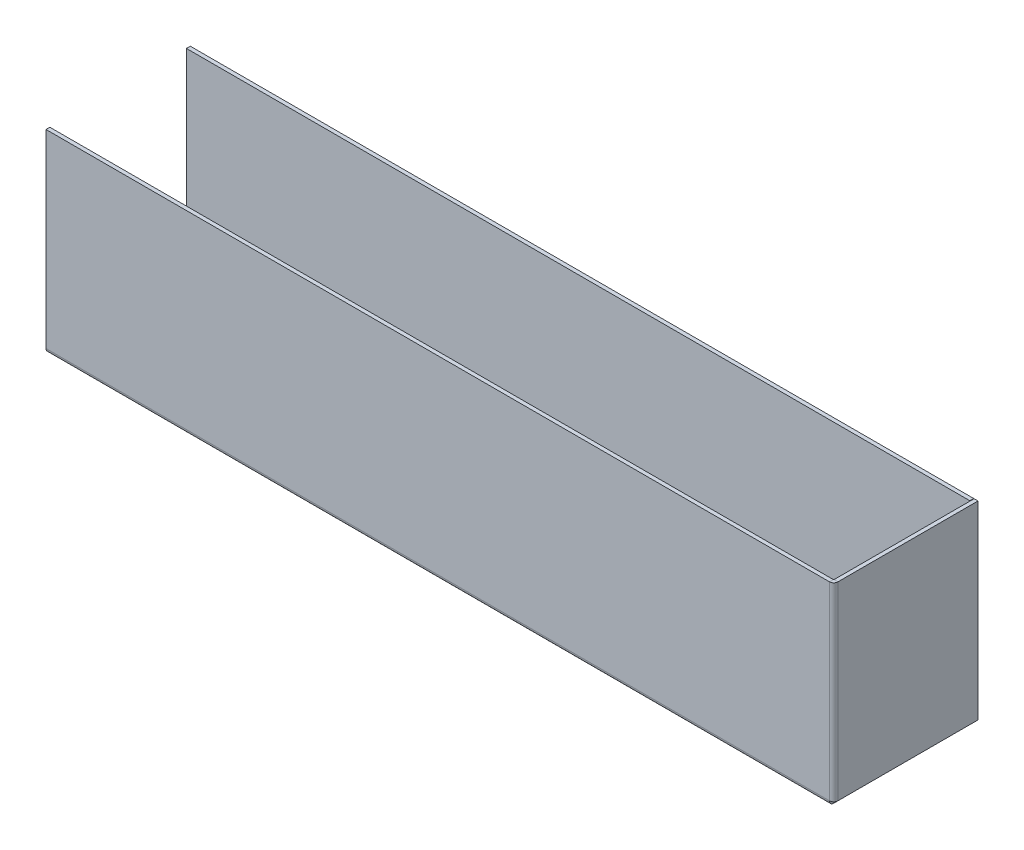
ISO-10303-21;
HEADER;
FILE_DESCRIPTION(('STEP AP214'),'2;1');
FILE_NAME('part.step','',(''),(''),'','','');
FILE_SCHEMA(('AUTOMOTIVE_DESIGN { 1 0 10303 214 1 1 1 1 }'));
ENDSEC;
DATA;
#1=APPLICATION_CONTEXT('core data for automotive mechanical design processes');
#2=APPLICATION_PROTOCOL_DEFINITION('international standard','automotive_design',2000,#1);
#3=PRODUCT_CONTEXT('',#1,'mechanical');
#4=PRODUCT('Part','Part','',(#3));
#5=PRODUCT_RELATED_PRODUCT_CATEGORY('part','',(#4));
#6=PRODUCT_DEFINITION_FORMATION('','',#4);
#7=PRODUCT_DEFINITION_CONTEXT('part definition',#1,'design');
#8=PRODUCT_DEFINITION('design','',#6,#7);
#9=PRODUCT_DEFINITION_SHAPE('','',#8);
#10=(LENGTH_UNIT() NAMED_UNIT(*) SI_UNIT(.MILLI.,.METRE.));
#11=(NAMED_UNIT(*) PLANE_ANGLE_UNIT() SI_UNIT($,.RADIAN.));
#12=(NAMED_UNIT(*) SI_UNIT($,.STERADIAN.) SOLID_ANGLE_UNIT());
#13=UNCERTAINTY_MEASURE_WITH_UNIT(LENGTH_MEASURE(1.E-05),#10,'distance_accuracy_value','');
#14=(GEOMETRIC_REPRESENTATION_CONTEXT(3) GLOBAL_UNCERTAINTY_ASSIGNED_CONTEXT((#13)) GLOBAL_UNIT_ASSIGNED_CONTEXT((#10,
#11,#12)) REPRESENTATION_CONTEXT('',''));
#15=CARTESIAN_POINT('',(0.,0.,0.));
#16=DIRECTION('',(0.,0.,1.));
#17=DIRECTION('',(1.,0.,0.));
#18=AXIS2_PLACEMENT_3D('',#15,#16,#17);
#19=CARTESIAN_POINT('',(0.,-1.,0.));
#20=DIRECTION('',(-1.,0.,0.));
#21=DIRECTION('',(0.,0.,1.));
#22=AXIS2_PLACEMENT_3D('',#19,#20,#21);
#23=PLANE('',#22);
#24=DIRECTION('',(0.,0.,1.));
#25=VECTOR('',#24,1.);
#26=CARTESIAN_POINT('',(0.,-1.,0.));
#27=LINE('',#26,#25);
#28=CARTESIAN_POINT('',(0.,-1.00000000000001,-13.5));
#29=VERTEX_POINT('',#28);
#30=CARTESIAN_POINT('',(0.,-1.,-0.26614580154031));
#31=VERTEX_POINT('',#30);
#32=EDGE_CURVE('E136',#29,#31,#27,.T.);
#33=ORIENTED_EDGE('',*,*,#32,.T.);
#34=DIRECTION('',(0.,1.,0.));
#35=VECTOR('',#34,1.);
#36=CARTESIAN_POINT('',(0.,-1.,-0.26614580154031));
#37=LINE('',#36,#35);
#38=CARTESIAN_POINT('',(0.,0.,-0.26614580154031));
#39=VERTEX_POINT('',#38);
#40=EDGE_CURVE('E469',#31,#39,#37,.T.);
#41=ORIENTED_EDGE('',*,*,#40,.T.);
#42=DIRECTION('',(0.,0.,1.));
#43=VECTOR('',#42,1.);
#44=CARTESIAN_POINT('',(0.,0.,0.));
#45=LINE('',#44,#43);
#46=CARTESIAN_POINT('',(0.,0.,-13.5));
#47=VERTEX_POINT('',#46);
#48=EDGE_CURVE('E179',#47,#39,#45,.T.);
#49=ORIENTED_EDGE('',*,*,#48,.F.);
#50=DIRECTION('',(0.,1.,0.));
#51=VECTOR('',#50,1.);
#52=CARTESIAN_POINT('',(0.,-1.,-13.5));
#53=LINE('',#52,#51);
#54=EDGE_CURVE('E14',#29,#47,#53,.T.);
#55=ORIENTED_EDGE('',*,*,#54,.F.);
#56=EDGE_LOOP('',(#33,#41,#49,#55));
#57=FACE_BOUND('',#56,.T.);
#58=ADVANCED_FACE('F101',(#57),#23,.T.);
#59=CARTESIAN_POINT('',(202.,-1.,0.));
#60=DIRECTION('',(1.,0.,0.));
#61=DIRECTION('',(0.,0.,-1.));
#62=AXIS2_PLACEMENT_3D('',#59,#60,#61);
#63=PLANE('',#62);
#64=DIRECTION('',(0.,1.,0.));
#65=VECTOR('',#64,1.);
#66=CARTESIAN_POINT('',(202.,-1.,-13.5));
#67=LINE('',#66,#65);
#68=CARTESIAN_POINT('',(202.,-1.,-13.5));
#69=VERTEX_POINT('',#68);
#70=CARTESIAN_POINT('',(202.,0.,-13.5));
#71=VERTEX_POINT('',#70);
#72=EDGE_CURVE('E104',#69,#71,#67,.T.);
#73=ORIENTED_EDGE('',*,*,#72,.T.);
#74=DIRECTION('',(0.,0.,-1.));
#75=VECTOR('',#74,1.);
#76=CARTESIAN_POINT('',(202.,0.,0.));
#77=LINE('',#76,#75);
#78=CARTESIAN_POINT('',(202.,0.,-0.26614580154031));
#79=VERTEX_POINT('',#78);
#80=EDGE_CURVE('E129',#79,#71,#77,.T.);
#81=ORIENTED_EDGE('',*,*,#80,.F.);
#82=DIRECTION('',(0.,1.,0.));
#83=VECTOR('',#82,1.);
#84=CARTESIAN_POINT('',(202.,-1.,-0.26614580154031));
#85=LINE('',#84,#83);
#86=CARTESIAN_POINT('',(202.,-1.,-0.26614580154031));
#87=VERTEX_POINT('',#86);
#88=EDGE_CURVE('E471',#87,#79,#85,.T.);
#89=ORIENTED_EDGE('',*,*,#88,.F.);
#90=DIRECTION('',(0.,0.,-1.));
#91=VECTOR('',#90,1.);
#92=CARTESIAN_POINT('',(202.,-1.,0.));
#93=LINE('',#92,#91);
#94=EDGE_CURVE('E116',#87,#69,#93,.T.);
#95=ORIENTED_EDGE('',*,*,#94,.T.);
#96=EDGE_LOOP('',(#73,#81,#89,#95));
#97=FACE_BOUND('',#96,.T.);
#98=ADVANCED_FACE('F550',(#97),#63,.T.);
#99=CARTESIAN_POINT('',(0.,-1.,0.));
#100=DIRECTION('',(0.,-1.,0.));
#101=DIRECTION('',(0.,0.,-1.));
#102=AXIS2_PLACEMENT_3D('',#99,#100,#101);
#103=PLANE('',#102);
#104=DIRECTION('',(-1.,0.,0.));
#105=VECTOR('',#104,1.);
#106=CARTESIAN_POINT('',(202.,-1.,-0.26614580154031));
#107=LINE('',#106,#105);
#108=EDGE_CURVE('E431',#87,#31,#107,.T.);
#109=ORIENTED_EDGE('',*,*,#108,.T.);
#110=ORIENTED_EDGE('',*,*,#32,.F.);
#111=DIRECTION('',(-1.,0.,0.));
#112=VECTOR('',#111,1.);
#113=CARTESIAN_POINT('',(0.,-1.,-13.5));
#114=LINE('',#113,#112);
#115=EDGE_CURVE('E517',#69,#29,#114,.T.);
#116=ORIENTED_EDGE('',*,*,#115,.F.);
#117=ORIENTED_EDGE('',*,*,#94,.F.);
#118=EDGE_LOOP('',(#109,#110,#116,#117));
#119=FACE_BOUND('',#118,.T.);
#120=ADVANCED_FACE('F579',(#119),#103,.T.);
#121=CARTESIAN_POINT('',(0.,0.,0.));
#122=DIRECTION('',(0.,-1.,0.));
#123=DIRECTION('',(0.,0.,-1.));
#124=AXIS2_PLACEMENT_3D('',#121,#122,#123);
#125=PLANE('',#124);
#126=ORIENTED_EDGE('',*,*,#48,.T.);
#127=DIRECTION('',(-1.,0.,0.));
#128=VECTOR('',#127,1.);
#129=CARTESIAN_POINT('',(202.,0.,-0.26614580154031));
#130=LINE('',#129,#128);
#131=EDGE_CURVE('E408',#79,#39,#130,.T.);
#132=ORIENTED_EDGE('',*,*,#131,.F.);
#133=ORIENTED_EDGE('',*,*,#80,.T.);
#134=DIRECTION('',(-1.,0.,0.));
#135=VECTOR('',#134,1.);
#136=CARTESIAN_POINT('',(0.,0.,-13.5));
#137=LINE('',#136,#135);
#138=EDGE_CURVE('E515',#71,#47,#137,.T.);
#139=ORIENTED_EDGE('',*,*,#138,.T.);
#140=EDGE_LOOP('',(#126,#132,#133,#139));
#141=FACE_BOUND('',#140,.T.);
#142=ADVANCED_FACE('F522',(#141),#125,.F.);
#143=CARTESIAN_POINT('',(202.,0.100000000000003,-13.5));
#144=DIRECTION('',(1.,0.,0.));
#145=DIRECTION('',(0.,1.,0.));
#146=AXIS2_PLACEMENT_3D('',#143,#144,#145);
#147=PLANE('',#146);
#148=DIRECTION('',(0.,0.,1.));
#149=VECTOR('',#148,1.);
#150=CARTESIAN_POINT('',(202.,0.100000000000006,-14.6));
#151=LINE('',#150,#149);
#152=CARTESIAN_POINT('',(202.,0.100000000000003,-13.6));
#153=VERTEX_POINT('',#152);
#154=CARTESIAN_POINT('',(202.,0.0999999999999991,-14.6));
#155=VERTEX_POINT('',#154);
#156=EDGE_CURVE('E148',#153,#155,#151,.F.);
#157=ORIENTED_EDGE('',*,*,#156,.F.);
#158=CARTESIAN_POINT('',(202.,0.100000000000003,-13.5));
#159=DIRECTION('',(-1.,0.,0.));
#160=DIRECTION('',(0.,-1.,0.));
#161=AXIS2_PLACEMENT_3D('',#158,#159,#160);
#162=CIRCLE('',#161,0.0999999999999994);
#163=EDGE_CURVE('E510',#71,#153,#162,.F.);
#164=ORIENTED_EDGE('',*,*,#163,.F.);
#165=ORIENTED_EDGE('',*,*,#72,.F.);
#166=CARTESIAN_POINT('',(202.,0.100000000000003,-13.5));
#167=DIRECTION('',(-1.,0.,0.));
#168=DIRECTION('',(0.,-1.,0.));
#169=AXIS2_PLACEMENT_3D('',#166,#167,#168);
#170=CIRCLE('',#169,1.1);
#171=EDGE_CURVE('E507',#69,#155,#170,.F.);
#172=ORIENTED_EDGE('',*,*,#171,.T.);
#173=EDGE_LOOP('',(#157,#164,#165,#172));
#174=FACE_BOUND('',#173,.T.);
#175=ADVANCED_FACE('F549',(#174),#147,.T.);
#176=CARTESIAN_POINT('',(0.,0.0999999999999893,-13.5));
#177=DIRECTION('',(1.,0.,0.));
#178=DIRECTION('',(0.,1.,0.));
#179=AXIS2_PLACEMENT_3D('',#176,#177,#178);
#180=PLANE('',#179);
#181=CARTESIAN_POINT('',(0.,0.0999999999999893,-13.5));
#182=DIRECTION('',(-1.,0.,0.));
#183=DIRECTION('',(0.,-1.,0.));
#184=AXIS2_PLACEMENT_3D('',#181,#182,#183);
#185=CIRCLE('',#184,0.0999999999999994);
#186=CARTESIAN_POINT('',(0.,0.0999999999999889,-13.6));
#187=VERTEX_POINT('',#186);
#188=EDGE_CURVE('E484',#187,#47,#185,.T.);
#189=ORIENTED_EDGE('',*,*,#188,.F.);
#190=DIRECTION('',(0.,0.,1.));
#191=VECTOR('',#190,1.);
#192=CARTESIAN_POINT('',(0.,0.0999999999999942,-13.6));
#193=LINE('',#192,#191);
#194=CARTESIAN_POINT('',(0.,0.100000000000001,-14.6));
#195=VERTEX_POINT('',#194);
#196=EDGE_CURVE('E502',#187,#195,#193,.F.);
#197=ORIENTED_EDGE('',*,*,#196,.T.);
#198=CARTESIAN_POINT('',(0.,0.0999999999999893,-13.5));
#199=DIRECTION('',(-1.,0.,0.));
#200=DIRECTION('',(0.,-1.,0.));
#201=AXIS2_PLACEMENT_3D('',#198,#199,#200);
#202=CIRCLE('',#201,1.1);
#203=EDGE_CURVE('E175',#195,#29,#202,.T.);
#204=ORIENTED_EDGE('',*,*,#203,.T.);
#205=ORIENTED_EDGE('',*,*,#54,.T.);
#206=EDGE_LOOP('',(#189,#197,#204,#205));
#207=FACE_BOUND('',#206,.T.);
#208=ADVANCED_FACE('F526',(#207),#180,.F.);
#209=CARTESIAN_POINT('',(0.,0.0999999999999893,-13.5));
#210=DIRECTION('',(-1.,0.,0.));
#211=DIRECTION('',(0.,0.,-1.));
#212=AXIS2_PLACEMENT_3D('',#209,#210,#211);
#213=CYLINDRICAL_SURFACE('',#212,1.1);
#214=ORIENTED_EDGE('',*,*,#115,.T.);
#215=ORIENTED_EDGE('',*,*,#203,.F.);
#216=DIRECTION('',(-1.,0.,0.));
#217=VECTOR('',#216,1.);
#218=CARTESIAN_POINT('',(202.,0.100000000000006,-14.6));
#219=LINE('',#218,#217);
#220=EDGE_CURVE('E500',#195,#155,#219,.F.);
#221=ORIENTED_EDGE('',*,*,#220,.T.);
#222=ORIENTED_EDGE('',*,*,#171,.F.);
#223=EDGE_LOOP('',(#214,#215,#221,#222));
#224=FACE_BOUND('',#223,.T.);
#225=ADVANCED_FACE('F547',(#224),#213,.T.);
#226=CARTESIAN_POINT('',(0.,0.0999999999999893,-13.5));
#227=DIRECTION('',(-1.,0.,0.));
#228=DIRECTION('',(0.,0.,-1.));
#229=AXIS2_PLACEMENT_3D('',#226,#227,#228);
#230=CYLINDRICAL_SURFACE('',#229,0.0999999999999994);
#231=ORIENTED_EDGE('',*,*,#138,.F.);
#232=ORIENTED_EDGE('',*,*,#163,.T.);
#233=DIRECTION('',(-1.,0.,0.));
#234=VECTOR('',#233,1.);
#235=CARTESIAN_POINT('',(202.,0.0999999999999994,-13.6));
#236=LINE('',#235,#234);
#237=EDGE_CURVE('E504',#153,#187,#236,.T.);
#238=ORIENTED_EDGE('',*,*,#237,.T.);
#239=ORIENTED_EDGE('',*,*,#188,.T.);
#240=EDGE_LOOP('',(#231,#232,#238,#239));
#241=FACE_BOUND('',#240,.T.);
#242=ADVANCED_FACE('F528',(#241),#230,.F.);
#243=CARTESIAN_POINT('',(0.,49.,-14.6000000000002));
#244=DIRECTION('',(1.,0.,0.));
#245=DIRECTION('',(0.,0.,-1.));
#246=AXIS2_PLACEMENT_3D('',#243,#244,#245);
#247=PLANE('',#246);
#248=ORIENTED_EDGE('',*,*,#196,.F.);
#249=DIRECTION('',(0.,-1.,0.));
#250=VECTOR('',#249,1.);
#251=CARTESIAN_POINT('',(0.,49.,-13.6000000000002));
#252=LINE('',#251,#250);
#253=CARTESIAN_POINT('',(0.,49.,-13.6000000000002));
#254=VERTEX_POINT('',#253);
#255=EDGE_CURVE('E498',#187,#254,#252,.F.);
#256=ORIENTED_EDGE('',*,*,#255,.T.);
#257=DIRECTION('',(0.,0.,1.));
#258=VECTOR('',#257,1.);
#259=CARTESIAN_POINT('',(0.,49.,-14.6000000000002));
#260=LINE('',#259,#258);
#261=CARTESIAN_POINT('',(0.,49.,-14.6000000000002));
#262=VERTEX_POINT('',#261);
#263=EDGE_CURVE('E481',#262,#254,#260,.T.);
#264=ORIENTED_EDGE('',*,*,#263,.F.);
#265=DIRECTION('',(0.,1.,0.));
#266=VECTOR('',#265,1.);
#267=CARTESIAN_POINT('',(0.,0.,-14.6));
#268=LINE('',#267,#266);
#269=EDGE_CURVE('E491',#195,#262,#268,.T.);
#270=ORIENTED_EDGE('',*,*,#269,.F.);
#271=EDGE_LOOP('',(#248,#256,#264,#270));
#272=FACE_BOUND('',#271,.T.);
#273=ADVANCED_FACE('F543',(#272),#247,.F.);
#274=CARTESIAN_POINT('',(202.,0.,-14.6));
#275=DIRECTION('',(-1.,0.,0.));
#276=DIRECTION('',(0.,0.,1.));
#277=AXIS2_PLACEMENT_3D('',#274,#275,#276);
#278=PLANE('',#277);
#279=ORIENTED_EDGE('',*,*,#156,.T.);
#280=DIRECTION('',(0.,-1.,0.));
#281=VECTOR('',#280,1.);
#282=CARTESIAN_POINT('',(202.,0.,-14.6));
#283=LINE('',#282,#281);
#284=CARTESIAN_POINT('',(202.,49.,-14.6000000000002));
#285=VERTEX_POINT('',#284);
#286=EDGE_CURVE('E488',#285,#155,#283,.T.);
#287=ORIENTED_EDGE('',*,*,#286,.F.);
#288=DIRECTION('',(0.,0.,1.));
#289=VECTOR('',#288,1.);
#290=CARTESIAN_POINT('',(202.,49.,-14.6000000000002));
#291=LINE('',#290,#289);
#292=CARTESIAN_POINT('',(202.,49.,-13.6000000000002));
#293=VERTEX_POINT('',#292);
#294=EDGE_CURVE('E485',#285,#293,#291,.T.);
#295=ORIENTED_EDGE('',*,*,#294,.T.);
#296=DIRECTION('',(0.,1.,0.));
#297=VECTOR('',#296,1.);
#298=CARTESIAN_POINT('',(202.,0.,-13.6));
#299=LINE('',#298,#297);
#300=EDGE_CURVE('E493',#293,#153,#299,.F.);
#301=ORIENTED_EDGE('',*,*,#300,.T.);
#302=EDGE_LOOP('',(#279,#287,#295,#301));
#303=FACE_BOUND('',#302,.T.);
#304=ADVANCED_FACE('F536',(#303),#278,.F.);
#305=CARTESIAN_POINT('',(0.,0.,-14.6));
#306=DIRECTION('',(0.,0.,1.));
#307=DIRECTION('',(0.,-1.,0.));
#308=AXIS2_PLACEMENT_3D('',#305,#306,#307);
#309=PLANE('',#308);
#310=ORIENTED_EDGE('',*,*,#220,.F.);
#311=ORIENTED_EDGE('',*,*,#269,.T.);
#312=DIRECTION('',(1.,0.,0.));
#313=VECTOR('',#312,1.);
#314=CARTESIAN_POINT('',(0.,49.,-14.6000000000002));
#315=LINE('',#314,#313);
#316=EDGE_CURVE('E158',#262,#285,#315,.T.);
#317=ORIENTED_EDGE('',*,*,#316,.T.);
#318=ORIENTED_EDGE('',*,*,#286,.T.);
#319=EDGE_LOOP('',(#310,#311,#317,#318));
#320=FACE_BOUND('',#319,.T.);
#321=ADVANCED_FACE('F545',(#320),#309,.F.);
#322=CARTESIAN_POINT('',(0.,0.,-13.6));
#323=DIRECTION('',(0.,0.,1.));
#324=DIRECTION('',(0.,-1.,0.));
#325=AXIS2_PLACEMENT_3D('',#322,#323,#324);
#326=PLANE('',#325);
#327=ORIENTED_EDGE('',*,*,#255,.F.);
#328=ORIENTED_EDGE('',*,*,#237,.F.);
#329=ORIENTED_EDGE('',*,*,#300,.F.);
#330=DIRECTION('',(-1.,0.,0.));
#331=VECTOR('',#330,1.);
#332=CARTESIAN_POINT('',(202.,49.,-13.6000000000002));
#333=LINE('',#332,#331);
#334=EDGE_CURVE('E496',#254,#293,#333,.F.);
#335=ORIENTED_EDGE('',*,*,#334,.F.);
#336=EDGE_LOOP('',(#327,#328,#329,#335));
#337=FACE_BOUND('',#336,.T.);
#338=ADVANCED_FACE('F533',(#337),#326,.T.);
#339=CARTESIAN_POINT('',(202.,49.,-14.6000000000002));
#340=DIRECTION('',(0.,-1.,0.));
#341=DIRECTION('',(0.,0.,-1.));
#342=AXIS2_PLACEMENT_3D('',#339,#340,#341);
#343=PLANE('',#342);
#344=ORIENTED_EDGE('',*,*,#334,.T.);
#345=ORIENTED_EDGE('',*,*,#294,.F.);
#346=ORIENTED_EDGE('',*,*,#316,.F.);
#347=ORIENTED_EDGE('',*,*,#263,.T.);
#348=EDGE_LOOP('',(#344,#345,#346,#347));
#349=FACE_BOUND('',#348,.T.);
#350=ADVANCED_FACE('F539',(#349),#343,.F.);
#351=CARTESIAN_POINT('',(202.,0.0999999999999989,8.26614580154031));
#352=DIRECTION('',(-1.,0.,0.));
#353=DIRECTION('',(0.,0.,1.));
#354=AXIS2_PLACEMENT_3D('',#351,#352,#353);
#355=PLANE('',#354);
#356=DIRECTION('',(0.,1.,0.));
#357=VECTOR('',#356,1.);
#358=CARTESIAN_POINT('',(202.,-1.,8.26614580154031));
#359=LINE('',#358,#357);
#360=CARTESIAN_POINT('',(202.,-1.,8.26614580154031));
#361=VERTEX_POINT('',#360);
#362=CARTESIAN_POINT('',(202.,0.,8.26614580154031));
#363=VERTEX_POINT('',#362);
#364=EDGE_CURVE('E478',#361,#363,#359,.T.);
#365=ORIENTED_EDGE('',*,*,#364,.F.);
#366=CARTESIAN_POINT('',(202.,0.0999999999999989,8.26614580154031));
#367=DIRECTION('',(1.,0.,0.));
#368=DIRECTION('',(0.,0.,-1.));
#369=AXIS2_PLACEMENT_3D('',#366,#367,#368);
#370=CIRCLE('',#369,1.1);
#371=CARTESIAN_POINT('',(202.,-0.885416666666667,7.77731659511382));
#372=VERTEX_POINT('',#371);
#373=EDGE_CURVE('E439',#372,#361,#370,.F.);
#374=ORIENTED_EDGE('',*,*,#373,.F.);
#375=DIRECTION('',(0.,0.895833333333333,0.444390187660449));
#376=VECTOR('',#375,1.);
#377=CARTESIAN_POINT('',(202.,-0.885416666666667,7.77731659511382));
#378=LINE('',#377,#376);
#379=CARTESIAN_POINT('',(202.,0.0104166666666655,8.22170678277427));
#380=VERTEX_POINT('',#379);
#381=EDGE_CURVE('E476',#372,#380,#378,.T.);
#382=ORIENTED_EDGE('',*,*,#381,.T.);
#383=CARTESIAN_POINT('',(202.,0.0999999999999989,8.26614580154031));
#384=DIRECTION('',(-1.,0.,0.));
#385=DIRECTION('',(0.,0.,1.));
#386=AXIS2_PLACEMENT_3D('',#383,#384,#385);
#387=CIRCLE('',#386,0.1);
#388=EDGE_CURVE('E419',#380,#363,#387,.T.);
#389=ORIENTED_EDGE('',*,*,#388,.T.);
#390=EDGE_LOOP('',(#365,#374,#382,#389));
#391=FACE_BOUND('',#390,.T.);
#392=ADVANCED_FACE('F605',(#391),#355,.F.);
#393=CARTESIAN_POINT('',(202.,-8.5,4.));
#394=DIRECTION('',(-1.,0.,0.));
#395=DIRECTION('',(0.,0.,1.));
#396=AXIS2_PLACEMENT_3D('',#393,#394,#395);
#397=PLANE('',#396);
#398=ORIENTED_EDGE('',*,*,#381,.F.);
#399=CARTESIAN_POINT('',(202.,-8.5,4.));
#400=DIRECTION('',(1.,0.,0.));
#401=DIRECTION('',(0.,0.,-1.));
#402=AXIS2_PLACEMENT_3D('',#399,#400,#401);
#403=CIRCLE('',#402,8.5);
#404=CARTESIAN_POINT('',(202.,-0.885416666666667,0.222683404886184));
#405=VERTEX_POINT('',#404);
#406=EDGE_CURVE('E426',#405,#372,#403,.T.);
#407=ORIENTED_EDGE('',*,*,#406,.F.);
#408=DIRECTION('',(0.,0.895833333333333,-0.444390187660449));
#409=VECTOR('',#408,1.);
#410=CARTESIAN_POINT('',(202.,-0.885416666666667,0.222683404886184));
#411=LINE('',#410,#409);
#412=CARTESIAN_POINT('',(202.,0.0104166666666673,-0.221706782774265));
#413=VERTEX_POINT('',#412);
#414=EDGE_CURVE('E474',#405,#413,#411,.T.);
#415=ORIENTED_EDGE('',*,*,#414,.T.);
#416=CARTESIAN_POINT('',(202.,-8.5,4.));
#417=DIRECTION('',(-1.,0.,0.));
#418=DIRECTION('',(0.,0.,1.));
#419=AXIS2_PLACEMENT_3D('',#416,#417,#418);
#420=CIRCLE('',#419,9.5);
#421=EDGE_CURVE('E415',#413,#380,#420,.F.);
#422=ORIENTED_EDGE('',*,*,#421,.T.);
#423=EDGE_LOOP('',(#398,#407,#415,#422));
#424=FACE_BOUND('',#423,.T.);
#425=ADVANCED_FACE('F566',(#424),#397,.F.);
#426=CARTESIAN_POINT('',(202.,0.0999999999999994,-0.26614580154031));
#427=DIRECTION('',(-1.,0.,0.));
#428=DIRECTION('',(0.,0.,1.));
#429=AXIS2_PLACEMENT_3D('',#426,#427,#428);
#430=PLANE('',#429);
#431=ORIENTED_EDGE('',*,*,#414,.F.);
#432=CARTESIAN_POINT('',(202.,0.0999999999999994,-0.26614580154031));
#433=DIRECTION('',(1.,0.,0.));
#434=DIRECTION('',(0.,0.,-1.));
#435=AXIS2_PLACEMENT_3D('',#432,#433,#434);
#436=CIRCLE('',#435,1.1);
#437=EDGE_CURVE('E375',#87,#405,#436,.F.);
#438=ORIENTED_EDGE('',*,*,#437,.F.);
#439=ORIENTED_EDGE('',*,*,#88,.T.);
#440=CARTESIAN_POINT('',(202.,0.0999999999999994,-0.26614580154031));
#441=DIRECTION('',(-1.,0.,0.));
#442=DIRECTION('',(0.,0.,1.));
#443=AXIS2_PLACEMENT_3D('',#440,#441,#442);
#444=CIRCLE('',#443,0.1);
#445=EDGE_CURVE('E412',#79,#413,#444,.T.);
#446=ORIENTED_EDGE('',*,*,#445,.T.);
#447=EDGE_LOOP('',(#431,#438,#439,#446));
#448=FACE_BOUND('',#447,.T.);
#449=ADVANCED_FACE('F556',(#448),#430,.F.);
#450=CARTESIAN_POINT('',(0.,0.0999999999999994,-0.26614580154031));
#451=DIRECTION('',(-1.,0.,0.));
#452=DIRECTION('',(0.,0.,1.));
#453=AXIS2_PLACEMENT_3D('',#450,#451,#452);
#454=PLANE('',#453);
#455=ORIENTED_EDGE('',*,*,#40,.F.);
#456=CARTESIAN_POINT('',(0.,0.0999999999999994,-0.26614580154031));
#457=DIRECTION('',(1.,0.,0.));
#458=DIRECTION('',(0.,0.,-1.));
#459=AXIS2_PLACEMENT_3D('',#456,#457,#458);
#460=CIRCLE('',#459,1.1);
#461=CARTESIAN_POINT('',(0.,-0.885416666666667,0.222683404886184));
#462=VERTEX_POINT('',#461);
#463=EDGE_CURVE('E427',#31,#462,#460,.F.);
#464=ORIENTED_EDGE('',*,*,#463,.T.);
#465=DIRECTION('',(0.,0.895833333333333,-0.444390187660449));
#466=VECTOR('',#465,1.);
#467=CARTESIAN_POINT('',(0.,-0.885416666666667,0.222683404886184));
#468=LINE('',#467,#466);
#469=CARTESIAN_POINT('',(0.,0.010416666666666,-0.221706782774265));
#470=VERTEX_POINT('',#469);
#471=EDGE_CURVE('E467',#462,#470,#468,.T.);
#472=ORIENTED_EDGE('',*,*,#471,.T.);
#473=CARTESIAN_POINT('',(0.,0.0999999999999994,-0.26614580154031));
#474=DIRECTION('',(-1.,0.,0.));
#475=DIRECTION('',(0.,0.,1.));
#476=AXIS2_PLACEMENT_3D('',#473,#474,#475);
#477=CIRCLE('',#476,0.1);
#478=EDGE_CURVE('E396',#39,#470,#477,.T.);
#479=ORIENTED_EDGE('',*,*,#478,.F.);
#480=EDGE_LOOP('',(#455,#464,#472,#479));
#481=FACE_BOUND('',#480,.T.);
#482=ADVANCED_FACE('F581',(#481),#454,.T.);
#483=CARTESIAN_POINT('',(0.,-8.5,4.));
#484=DIRECTION('',(-1.,0.,0.));
#485=DIRECTION('',(0.,0.,1.));
#486=AXIS2_PLACEMENT_3D('',#483,#484,#485);
#487=PLANE('',#486);
#488=ORIENTED_EDGE('',*,*,#471,.F.);
#489=CARTESIAN_POINT('',(0.,-8.5,4.));
#490=DIRECTION('',(1.,0.,0.));
#491=DIRECTION('',(0.,0.,-1.));
#492=AXIS2_PLACEMENT_3D('',#489,#490,#491);
#493=CIRCLE('',#492,8.5);
#494=CARTESIAN_POINT('',(0.,-0.885416666666667,7.77731659511382));
#495=VERTEX_POINT('',#494);
#496=EDGE_CURVE('E434',#462,#495,#493,.T.);
#497=ORIENTED_EDGE('',*,*,#496,.T.);
#498=DIRECTION('',(0.,0.895833333333333,0.444390187660449));
#499=VECTOR('',#498,1.);
#500=CARTESIAN_POINT('',(0.,-0.885416666666667,7.77731659511382));
#501=LINE('',#500,#499);
#502=CARTESIAN_POINT('',(0.,0.0104166666666673,8.22170678277427));
#503=VERTEX_POINT('',#502);
#504=EDGE_CURVE('E465',#495,#503,#501,.T.);
#505=ORIENTED_EDGE('',*,*,#504,.T.);
#506=CARTESIAN_POINT('',(0.,-8.5,4.));
#507=DIRECTION('',(-1.,0.,0.));
#508=DIRECTION('',(0.,0.,1.));
#509=AXIS2_PLACEMENT_3D('',#506,#507,#508);
#510=CIRCLE('',#509,9.5);
#511=EDGE_CURVE('E392',#470,#503,#510,.F.);
#512=ORIENTED_EDGE('',*,*,#511,.F.);
#513=EDGE_LOOP('',(#488,#497,#505,#512));
#514=FACE_BOUND('',#513,.T.);
#515=ADVANCED_FACE('F627',(#514),#487,.T.);
#516=CARTESIAN_POINT('',(0.,0.0999999999999989,8.26614580154031));
#517=DIRECTION('',(-1.,0.,0.));
#518=DIRECTION('',(0.,0.,1.));
#519=AXIS2_PLACEMENT_3D('',#516,#517,#518);
#520=PLANE('',#519);
#521=ORIENTED_EDGE('',*,*,#504,.F.);
#522=CARTESIAN_POINT('',(0.,0.0999999999999989,8.26614580154031));
#523=DIRECTION('',(1.,0.,0.));
#524=DIRECTION('',(0.,0.,-1.));
#525=AXIS2_PLACEMENT_3D('',#522,#523,#524);
#526=CIRCLE('',#525,1.1);
#527=CARTESIAN_POINT('',(0.,-1.,8.26614580154031));
#528=VERTEX_POINT('',#527);
#529=EDGE_CURVE('E445',#495,#528,#526,.F.);
#530=ORIENTED_EDGE('',*,*,#529,.T.);
#531=DIRECTION('',(0.,1.,0.));
#532=VECTOR('',#531,1.);
#533=CARTESIAN_POINT('',(0.,-1.,8.26614580154031));
#534=LINE('',#533,#532);
#535=CARTESIAN_POINT('',(0.,0.,8.26614580154031));
#536=VERTEX_POINT('',#535);
#537=EDGE_CURVE('E463',#528,#536,#534,.T.);
#538=ORIENTED_EDGE('',*,*,#537,.T.);
#539=CARTESIAN_POINT('',(0.,0.0999999999999989,8.26614580154031));
#540=DIRECTION('',(-1.,0.,0.));
#541=DIRECTION('',(0.,0.,1.));
#542=AXIS2_PLACEMENT_3D('',#539,#540,#541);
#543=CIRCLE('',#542,0.1);
#544=EDGE_CURVE('E388',#503,#536,#543,.T.);
#545=ORIENTED_EDGE('',*,*,#544,.F.);
#546=EDGE_LOOP('',(#521,#530,#538,#545));
#547=FACE_BOUND('',#546,.T.);
#548=ADVANCED_FACE('F630',(#547),#520,.T.);
#549=CARTESIAN_POINT('',(0.,-1.,8.));
#550=DIRECTION('',(1.,0.,0.));
#551=DIRECTION('',(0.,0.,1.));
#552=AXIS2_PLACEMENT_3D('',#549,#550,#551);
#553=PLANE('',#552);
#554=ORIENTED_EDGE('',*,*,#537,.F.);
#555=DIRECTION('',(0.,0.,1.));
#556=VECTOR('',#555,1.);
#557=CARTESIAN_POINT('',(0.,-1.,8.));
#558=LINE('',#557,#556);
#559=CARTESIAN_POINT('',(0.,-1.,21.5));
#560=VERTEX_POINT('',#559);
#561=EDGE_CURVE('E453',#528,#560,#558,.T.);
#562=ORIENTED_EDGE('',*,*,#561,.T.);
#563=DIRECTION('',(0.,1.,0.));
#564=VECTOR('',#563,1.);
#565=CARTESIAN_POINT('',(0.,-1.,21.5));
#566=LINE('',#565,#564);
#567=CARTESIAN_POINT('',(0.,0.,21.5));
#568=VERTEX_POINT('',#567);
#569=EDGE_CURVE('E460',#560,#568,#566,.T.);
#570=ORIENTED_EDGE('',*,*,#569,.T.);
#571=DIRECTION('',(0.,0.,-1.));
#572=VECTOR('',#571,1.);
#573=CARTESIAN_POINT('',(0.,0.,8.));
#574=LINE('',#573,#572);
#575=EDGE_CURVE('E387',#536,#568,#574,.F.);
#576=ORIENTED_EDGE('',*,*,#575,.F.);
#577=EDGE_LOOP('',(#554,#562,#570,#576));
#578=FACE_BOUND('',#577,.T.);
#579=ADVANCED_FACE('F616',(#578),#553,.F.);
#580=CARTESIAN_POINT('',(202.,-1.,8.));
#581=DIRECTION('',(1.,0.,0.));
#582=DIRECTION('',(0.,0.,1.));
#583=AXIS2_PLACEMENT_3D('',#580,#581,#582);
#584=PLANE('',#583);
#585=DIRECTION('',(0.,0.,1.));
#586=VECTOR('',#585,1.);
#587=CARTESIAN_POINT('',(202.,-1.,8.));
#588=LINE('',#587,#586);
#589=CARTESIAN_POINT('',(202.,-0.999999999999998,21.5));
#590=VERTEX_POINT('',#589);
#591=EDGE_CURVE('E436',#361,#590,#588,.T.);
#592=ORIENTED_EDGE('',*,*,#591,.F.);
#593=ORIENTED_EDGE('',*,*,#364,.T.);
#594=DIRECTION('',(0.,0.,-1.));
#595=VECTOR('',#594,1.);
#596=CARTESIAN_POINT('',(202.,0.,8.));
#597=LINE('',#596,#595);
#598=CARTESIAN_POINT('',(202.,0.,21.5));
#599=VERTEX_POINT('',#598);
#600=EDGE_CURVE('E411',#363,#599,#597,.F.);
#601=ORIENTED_EDGE('',*,*,#600,.T.);
#602=DIRECTION('',(0.,1.,0.));
#603=VECTOR('',#602,1.);
#604=CARTESIAN_POINT('',(202.,-1.,21.5));
#605=LINE('',#604,#603);
#606=EDGE_CURVE('E399',#590,#599,#605,.T.);
#607=ORIENTED_EDGE('',*,*,#606,.F.);
#608=EDGE_LOOP('',(#592,#593,#601,#607));
#609=FACE_BOUND('',#608,.T.);
#610=ADVANCED_FACE('F612',(#609),#584,.T.);
#611=CARTESIAN_POINT('',(202.,0.,8.));
#612=DIRECTION('',(0.,-1.,0.));
#613=DIRECTION('',(0.,0.,-1.));
#614=AXIS2_PLACEMENT_3D('',#611,#612,#613);
#615=PLANE('',#614);
#616=DIRECTION('',(1.,0.,0.));
#617=VECTOR('',#616,1.);
#618=CARTESIAN_POINT('',(202.,0.,21.5));
#619=LINE('',#618,#617);
#620=EDGE_CURVE('E397',#599,#568,#619,.F.);
#621=ORIENTED_EDGE('',*,*,#620,.F.);
#622=ORIENTED_EDGE('',*,*,#600,.F.);
#623=DIRECTION('',(1.,0.,0.));
#624=VECTOR('',#623,1.);
#625=CARTESIAN_POINT('',(202.,0.,8.26614580154031));
#626=LINE('',#625,#624);
#627=EDGE_CURVE('E384',#363,#536,#626,.F.);
#628=ORIENTED_EDGE('',*,*,#627,.T.);
#629=ORIENTED_EDGE('',*,*,#575,.T.);
#630=EDGE_LOOP('',(#621,#622,#628,#629));
#631=FACE_BOUND('',#630,.T.);
#632=ADVANCED_FACE('F615',(#631),#615,.F.);
#633=CARTESIAN_POINT('',(202.,0.0999999999999989,8.26614580154031));
#634=DIRECTION('',(-1.,0.,0.));
#635=DIRECTION('',(0.,0.,1.));
#636=AXIS2_PLACEMENT_3D('',#633,#634,#635);
#637=CYLINDRICAL_SURFACE('',#636,0.1);
#638=ORIENTED_EDGE('',*,*,#627,.F.);
#639=ORIENTED_EDGE('',*,*,#388,.F.);
#640=DIRECTION('',(-1.,0.,0.));
#641=VECTOR('',#640,1.);
#642=CARTESIAN_POINT('',(202.,0.0104166666666655,8.22170678277427));
#643=LINE('',#642,#641);
#644=EDGE_CURVE('E389',#380,#503,#643,.T.);
#645=ORIENTED_EDGE('',*,*,#644,.T.);
#646=ORIENTED_EDGE('',*,*,#544,.T.);
#647=EDGE_LOOP('',(#638,#639,#645,#646));
#648=FACE_BOUND('',#647,.T.);
#649=ADVANCED_FACE('F655',(#648),#637,.F.);
#650=CARTESIAN_POINT('',(202.,-8.5,4.));
#651=DIRECTION('',(-1.,0.,0.));
#652=DIRECTION('',(0.,0.,1.));
#653=AXIS2_PLACEMENT_3D('',#650,#651,#652);
#654=CYLINDRICAL_SURFACE('',#653,9.5);
#655=ORIENTED_EDGE('',*,*,#644,.F.);
#656=ORIENTED_EDGE('',*,*,#421,.F.);
#657=DIRECTION('',(-1.,0.,0.));
#658=VECTOR('',#657,1.);
#659=CARTESIAN_POINT('',(202.,0.0104166666666673,-0.221706782774265));
#660=LINE('',#659,#658);
#661=EDGE_CURVE('E393',#413,#470,#660,.T.);
#662=ORIENTED_EDGE('',*,*,#661,.T.);
#663=ORIENTED_EDGE('',*,*,#511,.T.);
#664=EDGE_LOOP('',(#655,#656,#662,#663));
#665=FACE_BOUND('',#664,.T.);
#666=ADVANCED_FACE('F563',(#665),#654,.T.);
#667=CARTESIAN_POINT('',(202.,0.0999999999999994,-0.26614580154031));
#668=DIRECTION('',(-1.,0.,0.));
#669=DIRECTION('',(0.,0.,1.));
#670=AXIS2_PLACEMENT_3D('',#667,#668,#669);
#671=CYLINDRICAL_SURFACE('',#670,0.1);
#672=ORIENTED_EDGE('',*,*,#661,.F.);
#673=ORIENTED_EDGE('',*,*,#445,.F.);
#674=ORIENTED_EDGE('',*,*,#131,.T.);
#675=ORIENTED_EDGE('',*,*,#478,.T.);
#676=EDGE_LOOP('',(#672,#673,#674,#675));
#677=FACE_BOUND('',#676,.T.);
#678=ADVANCED_FACE('F558',(#677),#671,.F.);
#679=CARTESIAN_POINT('',(202.,-1.,8.));
#680=DIRECTION('',(0.,-1.,0.));
#681=DIRECTION('',(0.,0.,-1.));
#682=AXIS2_PLACEMENT_3D('',#679,#680,#681);
#683=PLANE('',#682);
#684=DIRECTION('',(-1.,0.,0.));
#685=VECTOR('',#684,1.);
#686=CARTESIAN_POINT('',(202.,-1.,21.5));
#687=LINE('',#686,#685);
#688=EDGE_CURVE('E416',#590,#560,#687,.T.);
#689=ORIENTED_EDGE('',*,*,#688,.T.);
#690=ORIENTED_EDGE('',*,*,#561,.F.);
#691=DIRECTION('',(-1.,0.,0.));
#692=VECTOR('',#691,1.);
#693=CARTESIAN_POINT('',(202.,-1.,8.26614580154031));
#694=LINE('',#693,#692);
#695=EDGE_CURVE('E450',#361,#528,#694,.T.);
#696=ORIENTED_EDGE('',*,*,#695,.F.);
#697=ORIENTED_EDGE('',*,*,#591,.T.);
#698=EDGE_LOOP('',(#689,#690,#696,#697));
#699=FACE_BOUND('',#698,.T.);
#700=ADVANCED_FACE('F638',(#699),#683,.T.);
#701=CARTESIAN_POINT('',(202.,0.0999999999999989,8.26614580154031));
#702=DIRECTION('',(-1.,0.,0.));
#703=DIRECTION('',(0.,0.,1.));
#704=AXIS2_PLACEMENT_3D('',#701,#702,#703);
#705=CYLINDRICAL_SURFACE('',#704,1.1);
#706=ORIENTED_EDGE('',*,*,#695,.T.);
#707=ORIENTED_EDGE('',*,*,#529,.F.);
#708=DIRECTION('',(-1.,0.,0.));
#709=VECTOR('',#708,1.);
#710=CARTESIAN_POINT('',(202.,-0.885416666666667,7.77731659511382));
#711=LINE('',#710,#709);
#712=EDGE_CURVE('E442',#372,#495,#711,.T.);
#713=ORIENTED_EDGE('',*,*,#712,.F.);
#714=ORIENTED_EDGE('',*,*,#373,.T.);
#715=EDGE_LOOP('',(#706,#707,#713,#714));
#716=FACE_BOUND('',#715,.T.);
#717=ADVANCED_FACE('F641',(#716),#705,.T.);
#718=CARTESIAN_POINT('',(202.,-8.5,4.));
#719=DIRECTION('',(-1.,0.,0.));
#720=DIRECTION('',(0.,0.,1.));
#721=AXIS2_PLACEMENT_3D('',#718,#719,#720);
#722=CYLINDRICAL_SURFACE('',#721,8.5);
#723=ORIENTED_EDGE('',*,*,#712,.T.);
#724=ORIENTED_EDGE('',*,*,#496,.F.);
#725=DIRECTION('',(-1.,0.,0.));
#726=VECTOR('',#725,1.);
#727=CARTESIAN_POINT('',(202.,-0.885416666666667,0.222683404886184));
#728=LINE('',#727,#726);
#729=EDGE_CURVE('E430',#405,#462,#728,.T.);
#730=ORIENTED_EDGE('',*,*,#729,.F.);
#731=ORIENTED_EDGE('',*,*,#406,.T.);
#732=EDGE_LOOP('',(#723,#724,#730,#731));
#733=FACE_BOUND('',#732,.T.);
#734=ADVANCED_FACE('F572',(#733),#722,.F.);
#735=CARTESIAN_POINT('',(202.,0.0999999999999994,-0.26614580154031));
#736=DIRECTION('',(-1.,0.,0.));
#737=DIRECTION('',(0.,0.,1.));
#738=AXIS2_PLACEMENT_3D('',#735,#736,#737);
#739=CYLINDRICAL_SURFACE('',#738,1.1);
#740=ORIENTED_EDGE('',*,*,#729,.T.);
#741=ORIENTED_EDGE('',*,*,#463,.F.);
#742=ORIENTED_EDGE('',*,*,#108,.F.);
#743=ORIENTED_EDGE('',*,*,#437,.T.);
#744=EDGE_LOOP('',(#740,#741,#742,#743));
#745=FACE_BOUND('',#744,.T.);
#746=ADVANCED_FACE('F577',(#745),#739,.T.);
#747=CARTESIAN_POINT('',(0.,0.100000000000001,21.5));
#748=DIRECTION('',(-1.,0.,0.));
#749=DIRECTION('',(0.,0.,1.));
#750=AXIS2_PLACEMENT_3D('',#747,#748,#749);
#751=PLANE('',#750);
#752=DIRECTION('',(0.,0.,-1.));
#753=VECTOR('',#752,1.);
#754=CARTESIAN_POINT('',(0.,0.0999999999999994,22.6));
#755=LINE('',#754,#753);
#756=CARTESIAN_POINT('',(0.,0.100000000000001,21.6));
#757=VERTEX_POINT('',#756);
#758=CARTESIAN_POINT('',(0.,0.100000000000001,22.6));
#759=VERTEX_POINT('',#758);
#760=EDGE_CURVE('E330',#757,#759,#755,.F.);
#761=ORIENTED_EDGE('',*,*,#760,.F.);
#762=CARTESIAN_POINT('',(0.,0.100000000000001,21.5));
#763=DIRECTION('',(1.,0.,0.));
#764=DIRECTION('',(0.,0.,-1.));
#765=AXIS2_PLACEMENT_3D('',#762,#763,#764);
#766=CIRCLE('',#765,0.0999999999999994);
#767=EDGE_CURVE('E379',#568,#757,#766,.F.);
#768=ORIENTED_EDGE('',*,*,#767,.F.);
#769=ORIENTED_EDGE('',*,*,#569,.F.);
#770=CARTESIAN_POINT('',(0.,0.100000000000001,21.5));
#771=DIRECTION('',(1.,0.,0.));
#772=DIRECTION('',(0.,0.,-1.));
#773=AXIS2_PLACEMENT_3D('',#770,#771,#772);
#774=CIRCLE('',#773,1.1);
#775=EDGE_CURVE('E372',#560,#759,#774,.F.);
#776=ORIENTED_EDGE('',*,*,#775,.T.);
#777=EDGE_LOOP('',(#761,#768,#769,#776));
#778=FACE_BOUND('',#777,.T.);
#779=ADVANCED_FACE('F650',(#778),#751,.T.);
#780=CARTESIAN_POINT('',(202.,0.100000000000001,21.5));
#781=DIRECTION('',(-1.,0.,0.));
#782=DIRECTION('',(0.,0.,1.));
#783=AXIS2_PLACEMENT_3D('',#780,#781,#782);
#784=PLANE('',#783);
#785=CARTESIAN_POINT('',(202.,0.100000000000001,21.5));
#786=DIRECTION('',(1.,0.,0.));
#787=DIRECTION('',(0.,0.,-1.));
#788=AXIS2_PLACEMENT_3D('',#785,#786,#787);
#789=CIRCLE('',#788,0.0999999999999994);
#790=CARTESIAN_POINT('',(202.,0.100000000000002,21.6));
#791=VERTEX_POINT('',#790);
#792=EDGE_CURVE('E343',#791,#599,#789,.T.);
#793=ORIENTED_EDGE('',*,*,#792,.F.);
#794=DIRECTION('',(0.,0.,-1.));
#795=VECTOR('',#794,1.);
#796=CARTESIAN_POINT('',(202.,0.100000000000003,21.6));
#797=LINE('',#796,#795);
#798=CARTESIAN_POINT('',(202.,0.100000000000002,22.6));
#799=VERTEX_POINT('',#798);
#800=EDGE_CURVE('E364',#791,#799,#797,.F.);
#801=ORIENTED_EDGE('',*,*,#800,.T.);
#802=CARTESIAN_POINT('',(202.,0.100000000000001,21.5));
#803=DIRECTION('',(1.,0.,0.));
#804=DIRECTION('',(0.,0.,-1.));
#805=AXIS2_PLACEMENT_3D('',#802,#803,#804);
#806=CIRCLE('',#805,1.1);
#807=EDGE_CURVE('E376',#799,#590,#806,.T.);
#808=ORIENTED_EDGE('',*,*,#807,.T.);
#809=ORIENTED_EDGE('',*,*,#606,.T.);
#810=EDGE_LOOP('',(#793,#801,#808,#809));
#811=FACE_BOUND('',#810,.T.);
#812=ADVANCED_FACE('F662',(#811),#784,.F.);
#813=CARTESIAN_POINT('',(202.,0.100000000000001,21.5));
#814=DIRECTION('',(1.,0.,0.));
#815=DIRECTION('',(0.,0.,1.));
#816=AXIS2_PLACEMENT_3D('',#813,#814,#815);
#817=CYLINDRICAL_SURFACE('',#816,1.1);
#818=ORIENTED_EDGE('',*,*,#688,.F.);
#819=ORIENTED_EDGE('',*,*,#807,.F.);
#820=DIRECTION('',(1.,0.,0.));
#821=VECTOR('',#820,1.);
#822=CARTESIAN_POINT('',(0.,0.0999999999999994,22.6));
#823=LINE('',#822,#821);
#824=EDGE_CURVE('E362',#799,#759,#823,.F.);
#825=ORIENTED_EDGE('',*,*,#824,.T.);
#826=ORIENTED_EDGE('',*,*,#775,.F.);
#827=EDGE_LOOP('',(#818,#819,#825,#826));
#828=FACE_BOUND('',#827,.T.);
#829=ADVANCED_FACE('F665',(#828),#817,.T.);
#830=CARTESIAN_POINT('',(202.,0.100000000000001,21.5));
#831=DIRECTION('',(1.,0.,0.));
#832=DIRECTION('',(0.,0.,1.));
#833=AXIS2_PLACEMENT_3D('',#830,#831,#832);
#834=CYLINDRICAL_SURFACE('',#833,0.0999999999999994);
#835=ORIENTED_EDGE('',*,*,#620,.T.);
#836=ORIENTED_EDGE('',*,*,#767,.T.);
#837=DIRECTION('',(1.,0.,0.));
#838=VECTOR('',#837,1.);
#839=CARTESIAN_POINT('',(0.,0.0999999999999994,21.6));
#840=LINE('',#839,#838);
#841=EDGE_CURVE('E367',#757,#791,#840,.T.);
#842=ORIENTED_EDGE('',*,*,#841,.T.);
#843=ORIENTED_EDGE('',*,*,#792,.T.);
#844=EDGE_LOOP('',(#835,#836,#842,#843));
#845=FACE_BOUND('',#844,.T.);
#846=ADVANCED_FACE('F670',(#845),#834,.F.);
#847=CARTESIAN_POINT('',(0.,0.,22.6));
#848=DIRECTION('',(1.,0.,0.));
#849=DIRECTION('',(0.,0.,-1.));
#850=AXIS2_PLACEMENT_3D('',#847,#848,#849);
#851=PLANE('',#850);
#852=ORIENTED_EDGE('',*,*,#760,.T.);
#853=DIRECTION('',(0.,-1.,0.));
#854=VECTOR('',#853,1.);
#855=CARTESIAN_POINT('',(0.,0.,22.6));
#856=LINE('',#855,#854);
#857=CARTESIAN_POINT('',(0.,49.,22.6));
#858=VERTEX_POINT('',#857);
#859=EDGE_CURVE('E347',#858,#759,#856,.T.);
#860=ORIENTED_EDGE('',*,*,#859,.F.);
#861=DIRECTION('',(0.,0.,-1.));
#862=VECTOR('',#861,1.);
#863=CARTESIAN_POINT('',(0.,49.,22.6));
#864=LINE('',#863,#862);
#865=CARTESIAN_POINT('',(0.,49.,21.6));
#866=VERTEX_POINT('',#865);
#867=EDGE_CURVE('E344',#858,#866,#864,.T.);
#868=ORIENTED_EDGE('',*,*,#867,.T.);
#869=DIRECTION('',(0.,1.,0.));
#870=VECTOR('',#869,1.);
#871=CARTESIAN_POINT('',(0.,0.,21.6));
#872=LINE('',#871,#870);
#873=EDGE_CURVE('E355',#866,#757,#872,.F.);
#874=ORIENTED_EDGE('',*,*,#873,.T.);
#875=EDGE_LOOP('',(#852,#860,#868,#874));
#876=FACE_BOUND('',#875,.T.);
#877=ADVANCED_FACE('F673',(#876),#851,.F.);
#878=CARTESIAN_POINT('',(0.,0.,22.6));
#879=DIRECTION('',(0.,0.,-1.));
#880=DIRECTION('',(-1.,0.,0.));
#881=AXIS2_PLACEMENT_3D('',#878,#879,#880);
#882=PLANE('',#881);
#883=ORIENTED_EDGE('',*,*,#824,.F.);
#884=DIRECTION('',(0.,1.,0.));
#885=VECTOR('',#884,1.);
#886=CARTESIAN_POINT('',(202.,0.,22.6));
#887=LINE('',#886,#885);
#888=CARTESIAN_POINT('',(202.,49.,22.6));
#889=VERTEX_POINT('',#888);
#890=EDGE_CURVE('E352',#799,#889,#887,.T.);
#891=ORIENTED_EDGE('',*,*,#890,.T.);
#892=DIRECTION('',(-1.,0.,0.));
#893=VECTOR('',#892,1.);
#894=CARTESIAN_POINT('',(0.,49.,22.6));
#895=LINE('',#894,#893);
#896=EDGE_CURVE('E350',#889,#858,#895,.T.);
#897=ORIENTED_EDGE('',*,*,#896,.T.);
#898=ORIENTED_EDGE('',*,*,#859,.T.);
#899=EDGE_LOOP('',(#883,#891,#897,#898));
#900=FACE_BOUND('',#899,.T.);
#901=ADVANCED_FACE('F686',(#900),#882,.F.);
#902=CARTESIAN_POINT('',(0.,0.,21.6));
#903=DIRECTION('',(0.,0.,-1.));
#904=DIRECTION('',(-1.,0.,0.));
#905=AXIS2_PLACEMENT_3D('',#902,#903,#904);
#906=PLANE('',#905);
#907=DIRECTION('',(0.,-1.,0.));
#908=VECTOR('',#907,1.);
#909=CARTESIAN_POINT('',(202.,49.,21.6));
#910=LINE('',#909,#908);
#911=CARTESIAN_POINT('',(202.,49.,21.6));
#912=VERTEX_POINT('',#911);
#913=EDGE_CURVE('E360',#791,#912,#910,.F.);
#914=ORIENTED_EDGE('',*,*,#913,.F.);
#915=ORIENTED_EDGE('',*,*,#841,.F.);
#916=ORIENTED_EDGE('',*,*,#873,.F.);
#917=DIRECTION('',(1.,0.,0.));
#918=VECTOR('',#917,1.);
#919=CARTESIAN_POINT('',(0.,49.,21.6));
#920=LINE('',#919,#918);
#921=EDGE_CURVE('E358',#912,#866,#920,.F.);
#922=ORIENTED_EDGE('',*,*,#921,.F.);
#923=EDGE_LOOP('',(#914,#915,#916,#922));
#924=FACE_BOUND('',#923,.T.);
#925=ADVANCED_FACE('F682',(#924),#906,.T.);
#926=CARTESIAN_POINT('',(0.,49.,22.6));
#927=DIRECTION('',(0.,-1.,0.));
#928=DIRECTION('',(0.,0.,-1.));
#929=AXIS2_PLACEMENT_3D('',#926,#927,#928);
#930=PLANE('',#929);
#931=ORIENTED_EDGE('',*,*,#921,.T.);
#932=ORIENTED_EDGE('',*,*,#867,.F.);
#933=ORIENTED_EDGE('',*,*,#896,.F.);
#934=DIRECTION('',(0.,0.,-1.));
#935=VECTOR('',#934,1.);
#936=CARTESIAN_POINT('',(202.,49.,22.6));
#937=LINE('',#936,#935);
#938=EDGE_CURVE('E340',#889,#912,#937,.T.);
#939=ORIENTED_EDGE('',*,*,#938,.T.);
#940=EDGE_LOOP('',(#931,#932,#933,#939));
#941=FACE_BOUND('',#940,.T.);
#942=ADVANCED_FACE('F678',(#941),#930,.F.);
#943=CARTESIAN_POINT('',(202.,49.,21.5));
#944=DIRECTION('',(0.,1.,0.));
#945=DIRECTION('',(0.,0.,1.));
#946=AXIS2_PLACEMENT_3D('',#943,#944,#945);
#947=PLANE('',#946);
#948=DIRECTION('',(-1.,0.,0.));
#949=VECTOR('',#948,1.);
#950=CARTESIAN_POINT('',(203.1,49.,21.5));
#951=LINE('',#950,#949);
#952=CARTESIAN_POINT('',(202.1,49.,21.5));
#953=VERTEX_POINT('',#952);
#954=CARTESIAN_POINT('',(203.1,49.,21.5));
#955=VERTEX_POINT('',#954);
#956=EDGE_CURVE('E309',#953,#955,#951,.F.);
#957=ORIENTED_EDGE('',*,*,#956,.F.);
#958=CARTESIAN_POINT('',(202.,49.,21.5));
#959=DIRECTION('',(0.,-1.,0.));
#960=DIRECTION('',(0.,0.,-1.));
#961=AXIS2_PLACEMENT_3D('',#958,#959,#960);
#962=CIRCLE('',#961,0.099999999999989);
#963=EDGE_CURVE('E334',#912,#953,#962,.F.);
#964=ORIENTED_EDGE('',*,*,#963,.F.);
#965=ORIENTED_EDGE('',*,*,#938,.F.);
#966=CARTESIAN_POINT('',(202.,49.,21.5));
#967=DIRECTION('',(0.,-1.,0.));
#968=DIRECTION('',(0.,0.,-1.));
#969=AXIS2_PLACEMENT_3D('',#966,#967,#968);
#970=CIRCLE('',#969,1.09999999999999);
#971=EDGE_CURVE('E327',#889,#955,#970,.F.);
#972=ORIENTED_EDGE('',*,*,#971,.T.);
#973=EDGE_LOOP('',(#957,#964,#965,#972));
#974=FACE_BOUND('',#973,.T.);
#975=ADVANCED_FACE('F681',(#974),#947,.T.);
#976=CARTESIAN_POINT('',(202.,0.100000000000002,21.5));
#977=DIRECTION('',(0.,1.,0.));
#978=DIRECTION('',(0.,0.,1.));
#979=AXIS2_PLACEMENT_3D('',#976,#977,#978);
#980=PLANE('',#979);
#981=CARTESIAN_POINT('',(202.,0.100000000000002,21.5));
#982=DIRECTION('',(0.,-1.,0.));
#983=DIRECTION('',(0.,0.,-1.));
#984=AXIS2_PLACEMENT_3D('',#981,#982,#983);
#985=CIRCLE('',#984,0.099999999999989);
#986=CARTESIAN_POINT('',(202.1,0.100000000000002,21.5));
#987=VERTEX_POINT('',#986);
#988=EDGE_CURVE('E337',#987,#791,#985,.T.);
#989=ORIENTED_EDGE('',*,*,#988,.F.);
#990=DIRECTION('',(-1.,0.,0.));
#991=VECTOR('',#990,1.);
#992=CARTESIAN_POINT('',(202.1,0.100000000000003,21.5));
#993=LINE('',#992,#991);
#994=CARTESIAN_POINT('',(203.1,0.100000000000002,21.5));
#995=VERTEX_POINT('',#994);
#996=EDGE_CURVE('E321',#987,#995,#993,.F.);
#997=ORIENTED_EDGE('',*,*,#996,.T.);
#998=CARTESIAN_POINT('',(202.,0.100000000000002,21.5));
#999=DIRECTION('',(0.,-1.,0.));
#1000=DIRECTION('',(0.,0.,-1.));
#1001=AXIS2_PLACEMENT_3D('',#998,#999,#1000);
#1002=CIRCLE('',#1001,1.09999999999999);
#1003=EDGE_CURVE('E331',#995,#799,#1002,.T.);
#1004=ORIENTED_EDGE('',*,*,#1003,.T.);
#1005=ORIENTED_EDGE('',*,*,#800,.F.);
#1006=EDGE_LOOP('',(#989,#997,#1004,#1005));
#1007=FACE_BOUND('',#1006,.T.);
#1008=ADVANCED_FACE('F694',(#1007),#980,.F.);
#1009=CARTESIAN_POINT('',(202.,0.10000000000001,21.5));
#1010=DIRECTION('',(0.,-1.,0.));
#1011=DIRECTION('',(1.,0.,0.));
#1012=AXIS2_PLACEMENT_3D('',#1009,#1010,#1011);
#1013=CYLINDRICAL_SURFACE('',#1012,1.09999999999999);
#1014=ORIENTED_EDGE('',*,*,#890,.F.);
#1015=ORIENTED_EDGE('',*,*,#1003,.F.);
#1016=DIRECTION('',(0.,-1.,0.));
#1017=VECTOR('',#1016,1.);
#1018=CARTESIAN_POINT('',(203.1,49.,21.5));
#1019=LINE('',#1018,#1017);
#1020=EDGE_CURVE('E319',#995,#955,#1019,.F.);
#1021=ORIENTED_EDGE('',*,*,#1020,.T.);
#1022=ORIENTED_EDGE('',*,*,#971,.F.);
#1023=EDGE_LOOP('',(#1014,#1015,#1021,#1022));
#1024=FACE_BOUND('',#1023,.T.);
#1025=ADVANCED_FACE('F697',(#1024),#1013,.T.);
#1026=CARTESIAN_POINT('',(202.,0.10000000000001,21.5));
#1027=DIRECTION('',(0.,-1.,0.));
#1028=DIRECTION('',(1.,0.,0.));
#1029=AXIS2_PLACEMENT_3D('',#1026,#1027,#1028);
#1030=CYLINDRICAL_SURFACE('',#1029,0.099999999999989);
#1031=ORIENTED_EDGE('',*,*,#913,.T.);
#1032=ORIENTED_EDGE('',*,*,#963,.T.);
#1033=DIRECTION('',(0.,-1.,0.));
#1034=VECTOR('',#1033,1.);
#1035=CARTESIAN_POINT('',(202.1,49.,21.5));
#1036=LINE('',#1035,#1034);
#1037=EDGE_CURVE('E324',#953,#987,#1036,.T.);
#1038=ORIENTED_EDGE('',*,*,#1037,.T.);
#1039=ORIENTED_EDGE('',*,*,#988,.T.);
#1040=EDGE_LOOP('',(#1031,#1032,#1038,#1039));
#1041=FACE_BOUND('',#1040,.T.);
#1042=ADVANCED_FACE('F702',(#1041),#1030,.F.);
#1043=CARTESIAN_POINT('',(203.1,0.100000000000001,-14.6));
#1044=DIRECTION('',(0.,1.,0.));
#1045=DIRECTION('',(0.,0.,1.));
#1046=AXIS2_PLACEMENT_3D('',#1043,#1044,#1045);
#1047=PLANE('',#1046);
#1048=ORIENTED_EDGE('',*,*,#996,.F.);
#1049=DIRECTION('',(0.,0.,1.));
#1050=VECTOR('',#1049,1.);
#1051=CARTESIAN_POINT('',(202.1,0.100000000000001,-14.6));
#1052=LINE('',#1051,#1050);
#1053=CARTESIAN_POINT('',(202.1,0.100000000000002,-14.6));
#1054=VERTEX_POINT('',#1053);
#1055=EDGE_CURVE('E317',#987,#1054,#1052,.F.);
#1056=ORIENTED_EDGE('',*,*,#1055,.T.);
#1057=DIRECTION('',(-1.,0.,0.));
#1058=VECTOR('',#1057,1.);
#1059=CARTESIAN_POINT('',(203.1,0.100000000000003,-14.6));
#1060=LINE('',#1059,#1058);
#1061=CARTESIAN_POINT('',(203.1,0.100000000000002,-14.6));
#1062=VERTEX_POINT('',#1061);
#1063=EDGE_CURVE('E305',#1062,#1054,#1060,.T.);
#1064=ORIENTED_EDGE('',*,*,#1063,.F.);
#1065=DIRECTION('',(0.,0.,-1.));
#1066=VECTOR('',#1065,1.);
#1067=CARTESIAN_POINT('',(203.1,0.100000000000001,7.77887375587053E-13));
#1068=LINE('',#1067,#1066);
#1069=EDGE_CURVE('E292',#995,#1062,#1068,.T.);
#1070=ORIENTED_EDGE('',*,*,#1069,.F.);
#1071=EDGE_LOOP('',(#1048,#1056,#1064,#1070));
#1072=FACE_BOUND('',#1071,.T.);
#1073=ADVANCED_FACE('F705',(#1072),#1047,.F.);
#1074=CARTESIAN_POINT('',(203.1,49.,21.6));
#1075=DIRECTION('',(0.,-1.,0.));
#1076=DIRECTION('',(0.,0.,-1.));
#1077=AXIS2_PLACEMENT_3D('',#1074,#1075,#1076);
#1078=PLANE('',#1077);
#1079=ORIENTED_EDGE('',*,*,#956,.T.);
#1080=DIRECTION('',(0.,0.,1.));
#1081=VECTOR('',#1080,1.);
#1082=CARTESIAN_POINT('',(203.1,49.,7.77887375587053E-13));
#1083=LINE('',#1082,#1081);
#1084=CARTESIAN_POINT('',(203.1,49.,-14.6));
#1085=VERTEX_POINT('',#1084);
#1086=EDGE_CURVE('E290',#1085,#955,#1083,.T.);
#1087=ORIENTED_EDGE('',*,*,#1086,.F.);
#1088=DIRECTION('',(-1.,0.,0.));
#1089=VECTOR('',#1088,1.);
#1090=CARTESIAN_POINT('',(203.1,49.,-14.6));
#1091=LINE('',#1090,#1089);
#1092=CARTESIAN_POINT('',(202.1,49.,-14.6));
#1093=VERTEX_POINT('',#1092);
#1094=EDGE_CURVE('E298',#1085,#1093,#1091,.T.);
#1095=ORIENTED_EDGE('',*,*,#1094,.T.);
#1096=DIRECTION('',(0.,0.,-1.));
#1097=VECTOR('',#1096,1.);
#1098=CARTESIAN_POINT('',(202.1,49.,21.6));
#1099=LINE('',#1098,#1097);
#1100=EDGE_CURVE('E314',#1093,#953,#1099,.F.);
#1101=ORIENTED_EDGE('',*,*,#1100,.T.);
#1102=EDGE_LOOP('',(#1079,#1087,#1095,#1101));
#1103=FACE_BOUND('',#1102,.T.);
#1104=ADVANCED_FACE('F308',(#1103),#1078,.F.);
#1105=CARTESIAN_POINT('',(203.1,0.,7.77887375587053E-13));
#1106=DIRECTION('',(-1.,0.,0.));
#1107=DIRECTION('',(0.,0.,1.));
#1108=AXIS2_PLACEMENT_3D('',#1105,#1106,#1107);
#1109=PLANE('',#1108);
#1110=ORIENTED_EDGE('',*,*,#1020,.F.);
#1111=ORIENTED_EDGE('',*,*,#1069,.T.);
#1112=DIRECTION('',(0.,1.,0.));
#1113=VECTOR('',#1112,1.);
#1114=CARTESIAN_POINT('',(203.1,0.,-14.6));
#1115=LINE('',#1114,#1113);
#1116=EDGE_CURVE('E285',#1062,#1085,#1115,.T.);
#1117=ORIENTED_EDGE('',*,*,#1116,.T.);
#1118=ORIENTED_EDGE('',*,*,#1086,.T.);
#1119=EDGE_LOOP('',(#1110,#1111,#1117,#1118));
#1120=FACE_BOUND('',#1119,.T.);
#1121=ADVANCED_FACE('F288',(#1120),#1109,.F.);
#1122=CARTESIAN_POINT('',(202.1,0.,7.7439589424821E-13));
#1123=DIRECTION('',(-1.,0.,0.));
#1124=DIRECTION('',(0.,0.,1.));
#1125=AXIS2_PLACEMENT_3D('',#1122,#1123,#1124);
#1126=PLANE('',#1125);
#1127=ORIENTED_EDGE('',*,*,#1055,.F.);
#1128=ORIENTED_EDGE('',*,*,#1037,.F.);
#1129=ORIENTED_EDGE('',*,*,#1100,.F.);
#1130=DIRECTION('',(0.,-1.,0.));
#1131=VECTOR('',#1130,1.);
#1132=CARTESIAN_POINT('',(202.1,49.,-14.6));
#1133=LINE('',#1132,#1131);
#1134=EDGE_CURVE('E301',#1054,#1093,#1133,.F.);
#1135=ORIENTED_EDGE('',*,*,#1134,.F.);
#1136=EDGE_LOOP('',(#1127,#1128,#1129,#1135));
#1137=FACE_BOUND('',#1136,.T.);
#1138=ADVANCED_FACE('F715',(#1137),#1126,.T.);
#1139=CARTESIAN_POINT('',(203.1,49.,-14.6));
#1140=DIRECTION('',(0.,0.,1.));
#1141=DIRECTION('',(1.,0.,0.));
#1142=AXIS2_PLACEMENT_3D('',#1139,#1140,#1141);
#1143=PLANE('',#1142);
#1144=ORIENTED_EDGE('',*,*,#1134,.T.);
#1145=ORIENTED_EDGE('',*,*,#1094,.F.);
#1146=ORIENTED_EDGE('',*,*,#1116,.F.);
#1147=ORIENTED_EDGE('',*,*,#1063,.T.);
#1148=EDGE_LOOP('',(#1144,#1145,#1146,#1147));
#1149=FACE_BOUND('',#1148,.T.);
#1150=ADVANCED_FACE('F299',(#1149),#1143,.F.);
#1151=CLOSED_SHELL('',(#58,#98,#120,#142,#175,#208,#225,#242,#273,#304,#321,#338,#350,#392,#425,
#449,#482,#515,#548,#579,#610,#632,#649,#666,#678,#700,#717,#734,#746,#779,#812,#829,#846,#877,
#901,#925,#942,#975,#1008,#1025,#1042,#1073,#1104,#1121,#1138,#1150));
#1152=MANIFOLD_SOLID_BREP('B2',#1151);
#1153=ADVANCED_BREP_SHAPE_REPRESENTATION('',(#18,#1152),#14);
#1154=SHAPE_DEFINITION_REPRESENTATION(#9,#1153);
ENDSEC;
END-ISO-10303-21;
